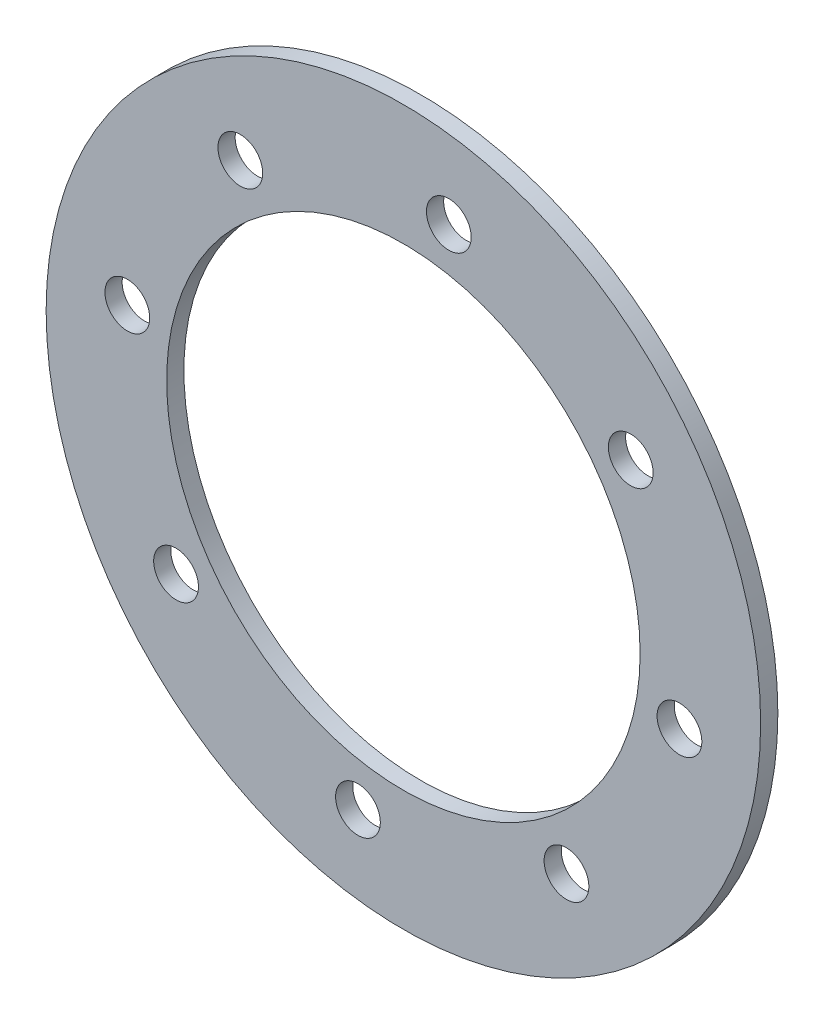
ISO-10303-21;
HEADER;
FILE_DESCRIPTION(('STEP AP214'),'2;1');
FILE_NAME('part.step','',(''),(''),'','','');
FILE_SCHEMA(('AUTOMOTIVE_DESIGN { 1 0 10303 214 1 1 1 1 }'));
ENDSEC;
DATA;
#1=APPLICATION_CONTEXT('core data for automotive mechanical design processes');
#2=APPLICATION_PROTOCOL_DEFINITION('international standard','automotive_design',2000,#1);
#3=PRODUCT_CONTEXT('',#1,'mechanical');
#4=PRODUCT('Part','Part','',(#3));
#5=PRODUCT_RELATED_PRODUCT_CATEGORY('part','',(#4));
#6=PRODUCT_DEFINITION_FORMATION('','',#4);
#7=PRODUCT_DEFINITION_CONTEXT('part definition',#1,'design');
#8=PRODUCT_DEFINITION('design','',#6,#7);
#9=PRODUCT_DEFINITION_SHAPE('','',#8);
#10=(LENGTH_UNIT() NAMED_UNIT(*) SI_UNIT(.MILLI.,.METRE.));
#11=(NAMED_UNIT(*) PLANE_ANGLE_UNIT() SI_UNIT($,.RADIAN.));
#12=(NAMED_UNIT(*) SI_UNIT($,.STERADIAN.) SOLID_ANGLE_UNIT());
#13=UNCERTAINTY_MEASURE_WITH_UNIT(LENGTH_MEASURE(1.E-05),#10,'distance_accuracy_value','');
#14=(GEOMETRIC_REPRESENTATION_CONTEXT(3) GLOBAL_UNCERTAINTY_ASSIGNED_CONTEXT((#13)) GLOBAL_UNIT_ASSIGNED_CONTEXT((#10,
#11,#12)) REPRESENTATION_CONTEXT('',''));
#15=CARTESIAN_POINT('',(0.,0.,0.));
#16=DIRECTION('',(0.,0.,1.));
#17=DIRECTION('',(1.,0.,0.));
#18=AXIS2_PLACEMENT_3D('',#15,#16,#17);
#19=CARTESIAN_POINT('',(0.,0.,2.));
#20=DIRECTION('',(0.,0.,1.));
#21=DIRECTION('',(1.,0.,0.));
#22=AXIS2_PLACEMENT_3D('',#19,#20,#21);
#23=PLANE('',#22);
#24=CARTESIAN_POINT('',(-32.0684409466708,5.27873993012438,2.));
#25=DIRECTION('',(0.,0.,1.));
#26=DIRECTION('',(1.,0.,0.));
#27=AXIS2_PLACEMENT_3D('',#24,#25,#26);
#28=CIRCLE('',#27,2.60000000000672);
#29=CARTESIAN_POINT('',(-29.4684409466641,5.27873993012438,2.));
#30=VERTEX_POINT('',#29);
#31=EDGE_CURVE('E83',#30,#30,#28,.T.);
#32=ORIENTED_EDGE('',*,*,#31,.F.);
#33=EDGE_LOOP('',(#32));
#34=FACE_BOUND('',#33,.T.);
#35=CARTESIAN_POINT('',(-5.27873993012445,-32.0684409466708,2.));
#36=DIRECTION('',(0.,0.,1.));
#37=DIRECTION('',(1.,0.,0.));
#38=AXIS2_PLACEMENT_3D('',#35,#36,#37);
#39=CIRCLE('',#38,2.60000000000672);
#40=CARTESIAN_POINT('',(-2.67873993011773,-32.0684409466708,2.));
#41=VERTEX_POINT('',#40);
#42=EDGE_CURVE('E71',#41,#41,#39,.T.);
#43=ORIENTED_EDGE('',*,*,#42,.F.);
#44=EDGE_LOOP('',(#43));
#45=FACE_BOUND('',#44,.T.);
#46=CARTESIAN_POINT('',(32.0684409466707,-5.27873993012443,2.));
#47=DIRECTION('',(0.,0.,1.));
#48=DIRECTION('',(1.,0.,0.));
#49=AXIS2_PLACEMENT_3D('',#46,#47,#48);
#50=CIRCLE('',#49,2.60000000000673);
#51=CARTESIAN_POINT('',(34.6684409466775,-5.27873993012443,2.));
#52=VERTEX_POINT('',#51);
#53=EDGE_CURVE('E59',#52,#52,#50,.T.);
#54=ORIENTED_EDGE('',*,*,#53,.F.);
#55=EDGE_LOOP('',(#54));
#56=FACE_BOUND('',#55,.T.);
#57=CARTESIAN_POINT('',(5.27873993012435,32.0684409466708,2.));
#58=DIRECTION('',(0.,0.,1.));
#59=DIRECTION('',(1.,0.,0.));
#60=AXIS2_PLACEMENT_3D('',#57,#58,#59);
#61=CIRCLE('',#60,2.60000000000672);
#62=CARTESIAN_POINT('',(7.87873993013107,32.0684409466708,2.));
#63=VERTEX_POINT('',#62);
#64=EDGE_CURVE('E47',#63,#63,#61,.T.);
#65=ORIENTED_EDGE('',*,*,#64,.F.);
#66=EDGE_LOOP('',(#65));
#67=FACE_BOUND('',#66,.T.);
#68=CARTESIAN_POINT('',(0.,0.,2.));
#69=DIRECTION('',(0.,0.,1.));
#70=DIRECTION('',(1.,0.,0.));
#71=AXIS2_PLACEMENT_3D('',#68,#69,#70);
#72=CIRCLE('',#71,41.5000000000067);
#73=CARTESIAN_POINT('',(41.5000000000067,0.,2.));
#74=VERTEX_POINT('',#73);
#75=EDGE_CURVE('E10',#74,#74,#72,.T.);
#76=ORIENTED_EDGE('',*,*,#75,.T.);
#77=EDGE_LOOP('',(#76));
#78=FACE_BOUND('',#77,.T.);
#79=CARTESIAN_POINT('',(0.,0.,2.));
#80=DIRECTION('',(0.,0.,1.));
#81=DIRECTION('',(1.,0.,0.));
#82=AXIS2_PLACEMENT_3D('',#79,#80,#81);
#83=CIRCLE('',#82,27.5000000000067);
#84=CARTESIAN_POINT('',(27.5000000000067,0.,2.));
#85=VERTEX_POINT('',#84);
#86=EDGE_CURVE('E42',#85,#85,#83,.T.);
#87=ORIENTED_EDGE('',*,*,#86,.F.);
#88=EDGE_LOOP('',(#87));
#89=FACE_BOUND('',#88,.T.);
#90=CARTESIAN_POINT('',(26.4084448561824,18.9431792547601,2.));
#91=DIRECTION('',(0.,0.,1.));
#92=DIRECTION('',(1.,0.,0.));
#93=AXIS2_PLACEMENT_3D('',#90,#91,#92);
#94=CIRCLE('',#93,2.60000000000672);
#95=CARTESIAN_POINT('',(29.0084448561891,18.9431792547601,2.));
#96=VERTEX_POINT('',#95);
#97=EDGE_CURVE('E53',#96,#96,#94,.T.);
#98=ORIENTED_EDGE('',*,*,#97,.F.);
#99=EDGE_LOOP('',(#98));
#100=FACE_BOUND('',#99,.T.);
#101=CARTESIAN_POINT('',(18.94317925476,-26.4084448561824,2.));
#102=DIRECTION('',(0.,0.,1.));
#103=DIRECTION('',(1.,0.,0.));
#104=AXIS2_PLACEMENT_3D('',#101,#102,#103);
#105=CIRCLE('',#104,2.60000000000673);
#106=CARTESIAN_POINT('',(21.5431792547668,-26.4084448561824,2.));
#107=VERTEX_POINT('',#106);
#108=EDGE_CURVE('E65',#107,#107,#105,.T.);
#109=ORIENTED_EDGE('',*,*,#108,.F.);
#110=EDGE_LOOP('',(#109));
#111=FACE_BOUND('',#110,.T.);
#112=CARTESIAN_POINT('',(-26.4084448561825,-18.9431792547601,2.));
#113=DIRECTION('',(0.,0.,1.));
#114=DIRECTION('',(1.,0.,0.));
#115=AXIS2_PLACEMENT_3D('',#112,#113,#114);
#116=CIRCLE('',#115,2.60000000000672);
#117=CARTESIAN_POINT('',(-23.8084448561757,-18.9431792547601,2.));
#118=VERTEX_POINT('',#117);
#119=EDGE_CURVE('E77',#118,#118,#116,.T.);
#120=ORIENTED_EDGE('',*,*,#119,.F.);
#121=EDGE_LOOP('',(#120));
#122=FACE_BOUND('',#121,.T.);
#123=CARTESIAN_POINT('',(-18.9431792547601,26.4084448561824,2.));
#124=DIRECTION('',(0.,0.,1.));
#125=DIRECTION('',(1.,0.,0.));
#126=AXIS2_PLACEMENT_3D('',#123,#124,#125);
#127=CIRCLE('',#126,2.60000000000673);
#128=CARTESIAN_POINT('',(-16.3431792547534,26.4084448561824,2.));
#129=VERTEX_POINT('',#128);
#130=EDGE_CURVE('E89',#129,#129,#127,.T.);
#131=ORIENTED_EDGE('',*,*,#130,.F.);
#132=EDGE_LOOP('',(#131));
#133=FACE_BOUND('',#132,.T.);
#134=ADVANCED_FACE('F31',(#34,#45,#56,#67,#78,#89,#100,#111,#122,#133),#23,.T.);
#135=CARTESIAN_POINT('',(0.,0.,0.));
#136=DIRECTION('',(0.,0.,1.));
#137=DIRECTION('',(1.,0.,0.));
#138=AXIS2_PLACEMENT_3D('',#135,#136,#137);
#139=PLANE('',#138);
#140=CARTESIAN_POINT('',(0.,0.,0.));
#141=DIRECTION('',(0.,0.,1.));
#142=DIRECTION('',(1.,0.,0.));
#143=AXIS2_PLACEMENT_3D('',#140,#141,#142);
#144=CIRCLE('',#143,41.5000000000067);
#145=CARTESIAN_POINT('',(41.5000000000067,0.,0.));
#146=VERTEX_POINT('',#145);
#147=EDGE_CURVE('E35',#146,#146,#144,.T.);
#148=ORIENTED_EDGE('',*,*,#147,.F.);
#149=EDGE_LOOP('',(#148));
#150=FACE_BOUND('',#149,.T.);
#151=CARTESIAN_POINT('',(0.,0.,0.));
#152=DIRECTION('',(0.,0.,1.));
#153=DIRECTION('',(1.,0.,0.));
#154=AXIS2_PLACEMENT_3D('',#151,#152,#153);
#155=CIRCLE('',#154,27.5000000000067);
#156=CARTESIAN_POINT('',(27.5000000000067,0.,0.));
#157=VERTEX_POINT('',#156);
#158=EDGE_CURVE('E44',#157,#157,#155,.T.);
#159=ORIENTED_EDGE('',*,*,#158,.T.);
#160=EDGE_LOOP('',(#159));
#161=FACE_BOUND('',#160,.T.);
#162=CARTESIAN_POINT('',(5.27873993012435,32.0684409466708,0.));
#163=DIRECTION('',(0.,0.,1.));
#164=DIRECTION('',(1.,0.,0.));
#165=AXIS2_PLACEMENT_3D('',#162,#163,#164);
#166=CIRCLE('',#165,2.60000000000672);
#167=CARTESIAN_POINT('',(7.87873993013107,32.0684409466708,0.));
#168=VERTEX_POINT('',#167);
#169=EDGE_CURVE('E50',#168,#168,#166,.T.);
#170=ORIENTED_EDGE('',*,*,#169,.T.);
#171=EDGE_LOOP('',(#170));
#172=FACE_BOUND('',#171,.T.);
#173=CARTESIAN_POINT('',(26.4084448561824,18.9431792547601,0.));
#174=DIRECTION('',(0.,0.,1.));
#175=DIRECTION('',(1.,0.,0.));
#176=AXIS2_PLACEMENT_3D('',#173,#174,#175);
#177=CIRCLE('',#176,2.60000000000672);
#178=CARTESIAN_POINT('',(29.0084448561891,18.9431792547601,0.));
#179=VERTEX_POINT('',#178);
#180=EDGE_CURVE('E56',#179,#179,#177,.T.);
#181=ORIENTED_EDGE('',*,*,#180,.T.);
#182=EDGE_LOOP('',(#181));
#183=FACE_BOUND('',#182,.T.);
#184=CARTESIAN_POINT('',(32.0684409466707,-5.27873993012443,0.));
#185=DIRECTION('',(0.,0.,1.));
#186=DIRECTION('',(1.,0.,0.));
#187=AXIS2_PLACEMENT_3D('',#184,#185,#186);
#188=CIRCLE('',#187,2.60000000000673);
#189=CARTESIAN_POINT('',(34.6684409466775,-5.27873993012443,0.));
#190=VERTEX_POINT('',#189);
#191=EDGE_CURVE('E62',#190,#190,#188,.T.);
#192=ORIENTED_EDGE('',*,*,#191,.T.);
#193=EDGE_LOOP('',(#192));
#194=FACE_BOUND('',#193,.T.);
#195=CARTESIAN_POINT('',(18.94317925476,-26.4084448561824,0.));
#196=DIRECTION('',(0.,0.,1.));
#197=DIRECTION('',(1.,0.,0.));
#198=AXIS2_PLACEMENT_3D('',#195,#196,#197);
#199=CIRCLE('',#198,2.60000000000673);
#200=CARTESIAN_POINT('',(21.5431792547668,-26.4084448561824,0.));
#201=VERTEX_POINT('',#200);
#202=EDGE_CURVE('E68',#201,#201,#199,.T.);
#203=ORIENTED_EDGE('',*,*,#202,.T.);
#204=EDGE_LOOP('',(#203));
#205=FACE_BOUND('',#204,.T.);
#206=CARTESIAN_POINT('',(-5.27873993012445,-32.0684409466708,0.));
#207=DIRECTION('',(0.,0.,1.));
#208=DIRECTION('',(1.,0.,0.));
#209=AXIS2_PLACEMENT_3D('',#206,#207,#208);
#210=CIRCLE('',#209,2.60000000000672);
#211=CARTESIAN_POINT('',(-2.67873993011773,-32.0684409466708,0.));
#212=VERTEX_POINT('',#211);
#213=EDGE_CURVE('E74',#212,#212,#210,.T.);
#214=ORIENTED_EDGE('',*,*,#213,.T.);
#215=EDGE_LOOP('',(#214));
#216=FACE_BOUND('',#215,.T.);
#217=CARTESIAN_POINT('',(-26.4084448561825,-18.9431792547601,0.));
#218=DIRECTION('',(0.,0.,1.));
#219=DIRECTION('',(1.,0.,0.));
#220=AXIS2_PLACEMENT_3D('',#217,#218,#219);
#221=CIRCLE('',#220,2.60000000000672);
#222=CARTESIAN_POINT('',(-23.8084448561757,-18.9431792547601,0.));
#223=VERTEX_POINT('',#222);
#224=EDGE_CURVE('E80',#223,#223,#221,.T.);
#225=ORIENTED_EDGE('',*,*,#224,.T.);
#226=EDGE_LOOP('',(#225));
#227=FACE_BOUND('',#226,.T.);
#228=CARTESIAN_POINT('',(-32.0684409466708,5.27873993012438,0.));
#229=DIRECTION('',(0.,0.,1.));
#230=DIRECTION('',(1.,0.,0.));
#231=AXIS2_PLACEMENT_3D('',#228,#229,#230);
#232=CIRCLE('',#231,2.60000000000672);
#233=CARTESIAN_POINT('',(-29.4684409466641,5.27873993012438,0.));
#234=VERTEX_POINT('',#233);
#235=EDGE_CURVE('E86',#234,#234,#232,.T.);
#236=ORIENTED_EDGE('',*,*,#235,.T.);
#237=EDGE_LOOP('',(#236));
#238=FACE_BOUND('',#237,.T.);
#239=CARTESIAN_POINT('',(-18.9431792547601,26.4084448561824,0.));
#240=DIRECTION('',(0.,0.,1.));
#241=DIRECTION('',(1.,0.,0.));
#242=AXIS2_PLACEMENT_3D('',#239,#240,#241);
#243=CIRCLE('',#242,2.60000000000673);
#244=CARTESIAN_POINT('',(-16.3431792547534,26.4084448561824,0.));
#245=VERTEX_POINT('',#244);
#246=EDGE_CURVE('E92',#245,#245,#243,.T.);
#247=ORIENTED_EDGE('',*,*,#246,.T.);
#248=EDGE_LOOP('',(#247));
#249=FACE_BOUND('',#248,.T.);
#250=ADVANCED_FACE('F102',(#150,#161,#172,#183,#194,#205,#216,#227,#238,#249),#139,.F.);
#251=CARTESIAN_POINT('',(0.,0.,2.));
#252=DIRECTION('',(0.,0.,-1.));
#253=DIRECTION('',(-1.,0.,0.));
#254=AXIS2_PLACEMENT_3D('',#251,#252,#253);
#255=CYLINDRICAL_SURFACE('',#254,41.5000000000067);
#256=ORIENTED_EDGE('',*,*,#75,.F.);
#257=EDGE_LOOP('',(#256));
#258=FACE_BOUND('',#257,.T.);
#259=ORIENTED_EDGE('',*,*,#147,.T.);
#260=EDGE_LOOP('',(#259));
#261=FACE_BOUND('',#260,.T.);
#262=ADVANCED_FACE('F33',(#258,#261),#255,.T.);
#263=CARTESIAN_POINT('',(0.,0.,2.));
#264=DIRECTION('',(0.,0.,-1.));
#265=DIRECTION('',(-1.,0.,0.));
#266=AXIS2_PLACEMENT_3D('',#263,#264,#265);
#267=CYLINDRICAL_SURFACE('',#266,27.5000000000067);
#268=ORIENTED_EDGE('',*,*,#86,.T.);
#269=EDGE_LOOP('',(#268));
#270=FACE_BOUND('',#269,.T.);
#271=ORIENTED_EDGE('',*,*,#158,.F.);
#272=EDGE_LOOP('',(#271));
#273=FACE_BOUND('',#272,.T.);
#274=ADVANCED_FACE('F112',(#270,#273),#267,.F.);
#275=CARTESIAN_POINT('',(5.27873993012435,32.0684409466708,2.));
#276=DIRECTION('',(0.,0.,-1.));
#277=DIRECTION('',(-1.,0.,0.));
#278=AXIS2_PLACEMENT_3D('',#275,#276,#277);
#279=CYLINDRICAL_SURFACE('',#278,2.60000000000672);
#280=ORIENTED_EDGE('',*,*,#64,.T.);
#281=EDGE_LOOP('',(#280));
#282=FACE_BOUND('',#281,.T.);
#283=ORIENTED_EDGE('',*,*,#169,.F.);
#284=EDGE_LOOP('',(#283));
#285=FACE_BOUND('',#284,.T.);
#286=ADVANCED_FACE('F115',(#282,#285),#279,.F.);
#287=CARTESIAN_POINT('',(26.4084448561824,18.9431792547601,2.));
#288=DIRECTION('',(0.,0.,-1.));
#289=DIRECTION('',(-1.,0.,0.));
#290=AXIS2_PLACEMENT_3D('',#287,#288,#289);
#291=CYLINDRICAL_SURFACE('',#290,2.60000000000672);
#292=ORIENTED_EDGE('',*,*,#97,.T.);
#293=EDGE_LOOP('',(#292));
#294=FACE_BOUND('',#293,.T.);
#295=ORIENTED_EDGE('',*,*,#180,.F.);
#296=EDGE_LOOP('',(#295));
#297=FACE_BOUND('',#296,.T.);
#298=ADVANCED_FACE('F119',(#294,#297),#291,.F.);
#299=CARTESIAN_POINT('',(32.0684409466707,-5.27873993012443,2.));
#300=DIRECTION('',(0.,0.,-1.));
#301=DIRECTION('',(-1.,0.,0.));
#302=AXIS2_PLACEMENT_3D('',#299,#300,#301);
#303=CYLINDRICAL_SURFACE('',#302,2.60000000000673);
#304=ORIENTED_EDGE('',*,*,#53,.T.);
#305=EDGE_LOOP('',(#304));
#306=FACE_BOUND('',#305,.T.);
#307=ORIENTED_EDGE('',*,*,#191,.F.);
#308=EDGE_LOOP('',(#307));
#309=FACE_BOUND('',#308,.T.);
#310=ADVANCED_FACE('F123',(#306,#309),#303,.F.);
#311=CARTESIAN_POINT('',(18.94317925476,-26.4084448561824,2.));
#312=DIRECTION('',(0.,0.,-1.));
#313=DIRECTION('',(-1.,0.,0.));
#314=AXIS2_PLACEMENT_3D('',#311,#312,#313);
#315=CYLINDRICAL_SURFACE('',#314,2.60000000000673);
#316=ORIENTED_EDGE('',*,*,#108,.T.);
#317=EDGE_LOOP('',(#316));
#318=FACE_BOUND('',#317,.T.);
#319=ORIENTED_EDGE('',*,*,#202,.F.);
#320=EDGE_LOOP('',(#319));
#321=FACE_BOUND('',#320,.T.);
#322=ADVANCED_FACE('F127',(#318,#321),#315,.F.);
#323=CARTESIAN_POINT('',(-5.27873993012445,-32.0684409466708,2.));
#324=DIRECTION('',(0.,0.,-1.));
#325=DIRECTION('',(-1.,0.,0.));
#326=AXIS2_PLACEMENT_3D('',#323,#324,#325);
#327=CYLINDRICAL_SURFACE('',#326,2.60000000000672);
#328=ORIENTED_EDGE('',*,*,#42,.T.);
#329=EDGE_LOOP('',(#328));
#330=FACE_BOUND('',#329,.T.);
#331=ORIENTED_EDGE('',*,*,#213,.F.);
#332=EDGE_LOOP('',(#331));
#333=FACE_BOUND('',#332,.T.);
#334=ADVANCED_FACE('F131',(#330,#333),#327,.F.);
#335=CARTESIAN_POINT('',(-26.4084448561825,-18.9431792547601,2.));
#336=DIRECTION('',(0.,0.,-1.));
#337=DIRECTION('',(-1.,0.,0.));
#338=AXIS2_PLACEMENT_3D('',#335,#336,#337);
#339=CYLINDRICAL_SURFACE('',#338,2.60000000000672);
#340=ORIENTED_EDGE('',*,*,#119,.T.);
#341=EDGE_LOOP('',(#340));
#342=FACE_BOUND('',#341,.T.);
#343=ORIENTED_EDGE('',*,*,#224,.F.);
#344=EDGE_LOOP('',(#343));
#345=FACE_BOUND('',#344,.T.);
#346=ADVANCED_FACE('F135',(#342,#345),#339,.F.);
#347=CARTESIAN_POINT('',(-32.0684409466708,5.27873993012438,2.));
#348=DIRECTION('',(0.,0.,-1.));
#349=DIRECTION('',(-1.,0.,0.));
#350=AXIS2_PLACEMENT_3D('',#347,#348,#349);
#351=CYLINDRICAL_SURFACE('',#350,2.60000000000672);
#352=ORIENTED_EDGE('',*,*,#31,.T.);
#353=EDGE_LOOP('',(#352));
#354=FACE_BOUND('',#353,.T.);
#355=ORIENTED_EDGE('',*,*,#235,.F.);
#356=EDGE_LOOP('',(#355));
#357=FACE_BOUND('',#356,.T.);
#358=ADVANCED_FACE('F139',(#354,#357),#351,.F.);
#359=CARTESIAN_POINT('',(-18.9431792547601,26.4084448561824,2.));
#360=DIRECTION('',(0.,0.,-1.));
#361=DIRECTION('',(-1.,0.,0.));
#362=AXIS2_PLACEMENT_3D('',#359,#360,#361);
#363=CYLINDRICAL_SURFACE('',#362,2.60000000000673);
#364=ORIENTED_EDGE('',*,*,#130,.T.);
#365=EDGE_LOOP('',(#364));
#366=FACE_BOUND('',#365,.T.);
#367=ORIENTED_EDGE('',*,*,#246,.F.);
#368=EDGE_LOOP('',(#367));
#369=FACE_BOUND('',#368,.T.);
#370=ADVANCED_FACE('F98',(#366,#369),#363,.F.);
#371=CLOSED_SHELL('',(#134,#250,#262,#274,#286,#298,#310,#322,#334,#346,#358,#370));
#372=MANIFOLD_SOLID_BREP('B2',#371);
#373=ADVANCED_BREP_SHAPE_REPRESENTATION('',(#18,#372),#14);
#374=SHAPE_DEFINITION_REPRESENTATION(#9,#373);
ENDSEC;
END-ISO-10303-21;
